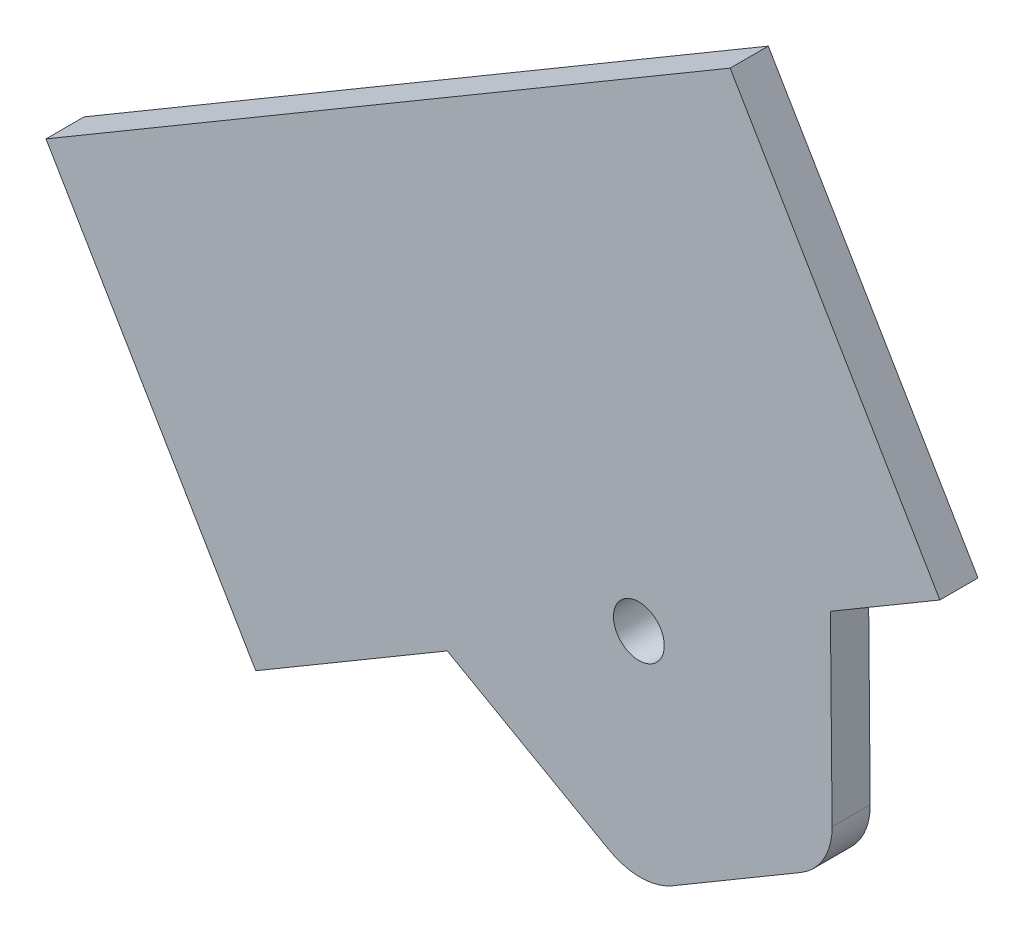
ISO-10303-21;
HEADER;
FILE_DESCRIPTION(('STEP AP214'),'2;1');
FILE_NAME('part.step','',(''),(''),'','','');
FILE_SCHEMA(('AUTOMOTIVE_DESIGN { 1 0 10303 214 1 1 1 1 }'));
ENDSEC;
DATA;
#1=APPLICATION_CONTEXT('core data for automotive mechanical design processes');
#2=APPLICATION_PROTOCOL_DEFINITION('international standard','automotive_design',2000,#1);
#3=PRODUCT_CONTEXT('',#1,'mechanical');
#4=PRODUCT('Part','Part','',(#3));
#5=PRODUCT_RELATED_PRODUCT_CATEGORY('part','',(#4));
#6=PRODUCT_DEFINITION_FORMATION('','',#4);
#7=PRODUCT_DEFINITION_CONTEXT('part definition',#1,'design');
#8=PRODUCT_DEFINITION('design','',#6,#7);
#9=PRODUCT_DEFINITION_SHAPE('','',#8);
#10=(LENGTH_UNIT() NAMED_UNIT(*) SI_UNIT(.MILLI.,.METRE.));
#11=(NAMED_UNIT(*) PLANE_ANGLE_UNIT() SI_UNIT($,.RADIAN.));
#12=(NAMED_UNIT(*) SI_UNIT($,.STERADIAN.) SOLID_ANGLE_UNIT());
#13=UNCERTAINTY_MEASURE_WITH_UNIT(LENGTH_MEASURE(1.E-05),#10,'distance_accuracy_value','');
#14=(GEOMETRIC_REPRESENTATION_CONTEXT(3) GLOBAL_UNCERTAINTY_ASSIGNED_CONTEXT((#13)) GLOBAL_UNIT_ASSIGNED_CONTEXT((#10,
#11,#12)) REPRESENTATION_CONTEXT('',''));
#15=CARTESIAN_POINT('',(0.,0.,0.));
#16=DIRECTION('',(0.,0.,1.));
#17=DIRECTION('',(1.,0.,0.));
#18=AXIS2_PLACEMENT_3D('',#15,#16,#17);
#19=CARTESIAN_POINT('',(48.5215928809247,334.718954291847,6.));
#20=DIRECTION('',(0.,0.,1.));
#21=DIRECTION('',(1.,0.,0.));
#22=AXIS2_PLACEMENT_3D('',#19,#20,#21);
#23=PLANE('',#22);
#24=DIRECTION('',(-0.861436542464855,-0.507865221595451,0.));
#25=VECTOR('',#24,1.);
#26=CARTESIAN_POINT('',(62.6758023990471,442.096939002382,6.));
#27=LINE('',#26,#25);
#28=CARTESIAN_POINT('',(62.6758023990471,442.096939002382,6.));
#29=VERTEX_POINT('',#28);
#30=CARTESIAN_POINT('',(-45.0037654090598,378.61378630295,6.));
#31=VERTEX_POINT('',#30);
#32=EDGE_CURVE('E169',#29,#31,#27,.T.);
#33=ORIENTED_EDGE('',*,*,#32,.T.);
#34=DIRECTION('',(0.507865221595452,-0.861436542464854,0.));
#35=VECTOR('',#34,1.);
#36=CARTESIAN_POINT('',(-45.0037654090598,378.61378630295,6.));
#37=LINE('',#36,#35);
#38=CARTESIAN_POINT('',(-11.9925260053554,322.620411042735,6.));
#39=VERTEX_POINT('',#38);
#40=EDGE_CURVE('E107',#31,#39,#37,.T.);
#41=ORIENTED_EDGE('',*,*,#40,.T.);
#42=DIRECTION('',(0.861436542464855,0.507865221595451,0.));
#43=VECTOR('',#42,1.);
#44=CARTESIAN_POINT('',(-11.9925260053554,322.620411042735,6.));
#45=LINE('',#44,#43);
#46=CARTESIAN_POINT('',(18.1577529809144,340.395693798575,6.));
#47=VERTEX_POINT('',#46);
#48=EDGE_CURVE('E190',#39,#47,#45,.T.);
#49=ORIENTED_EDGE('',*,*,#48,.T.);
#50=DIRECTION('',(0.87054245483269,-0.492093318725091,0.));
#51=VECTOR('',#50,1.);
#52=CARTESIAN_POINT('',(18.1577529809144,340.395693798575,6.));
#53=LINE('',#52,#51);
#54=CARTESIAN_POINT('',(43.6006596936724,326.013529743521,6.));
#55=VERTEX_POINT('',#54);
#56=EDGE_CURVE('E209',#47,#55,#53,.T.);
#57=ORIENTED_EDGE('',*,*,#56,.T.);
#58=CARTESIAN_POINT('',(48.5215928809247,334.718954291847,6.));
#59=DIRECTION('',(0.,0.,1.));
#60=DIRECTION('',(1.,0.,0.));
#61=AXIS2_PLACEMENT_3D('',#58,#59,#60);
#62=CIRCLE('',#61,9.99999999999956);
#63=CARTESIAN_POINT('',(53.6002450968778,326.104588867199,6.));
#64=VERTEX_POINT('',#63);
#65=EDGE_CURVE('E206',#55,#64,#62,.T.);
#66=ORIENTED_EDGE('',*,*,#65,.T.);
#67=DIRECTION('',(0.861436542464851,0.507865221595457,0.));
#68=VECTOR('',#67,1.);
#69=CARTESIAN_POINT('',(53.6002450968778,326.104588867199,6.));
#70=LINE('',#69,#68);
#71=CARTESIAN_POINT('',(73.8035116895097,338.015549175036,6.));
#72=VERTEX_POINT('',#71);
#73=EDGE_CURVE('E208',#64,#72,#70,.T.);
#74=ORIENTED_EDGE('',*,*,#73,.T.);
#75=CARTESIAN_POINT('',(68.7248594735504,346.62991459968,6.));
#76=DIRECTION('',(0.,0.,1.));
#77=DIRECTION('',(1.,0.,0.));
#78=AXIS2_PLACEMENT_3D('',#75,#76,#77);
#79=CIRCLE('',#78,9.99999999999771);
#80=CARTESIAN_POINT('',(78.7244448767529,346.720973723364,6.));
#81=VERTEX_POINT('',#80);
#82=EDGE_CURVE('E132',#72,#81,#79,.T.);
#83=ORIENTED_EDGE('',*,*,#82,.T.);
#84=DIRECTION('',(-0.00910591236757118,0.999958540320524,0.));
#85=VECTOR('',#84,1.);
#86=CARTESIAN_POINT('',(78.7244448767529,346.720973723364,6.));
#87=LINE('',#86,#85);
#88=CARTESIAN_POINT('',(78.4583109534542,375.946259310257,6.));
#89=VERTEX_POINT('',#88);
#90=EDGE_CURVE('E126',#81,#89,#87,.T.);
#91=ORIENTED_EDGE('',*,*,#90,.T.);
#92=DIRECTION('',(0.861436542464854,0.507865221595451,0.));
#93=VECTOR('',#92,1.);
#94=CARTESIAN_POINT('',(95.6870418027513,386.103563742166,6.));
#95=LINE('',#94,#93);
#96=CARTESIAN_POINT('',(95.6870418027513,386.103563742166,6.));
#97=VERTEX_POINT('',#96);
#98=EDGE_CURVE('E130',#89,#97,#95,.T.);
#99=ORIENTED_EDGE('',*,*,#98,.T.);
#100=DIRECTION('',(-0.50786522159545,0.861436542464855,0.));
#101=VECTOR('',#100,1.);
#102=CARTESIAN_POINT('',(62.6758023990471,442.096939002382,6.));
#103=LINE('',#102,#101);
#104=EDGE_CURVE('E58',#97,#29,#103,.T.);
#105=ORIENTED_EDGE('',*,*,#104,.T.);
#106=EDGE_LOOP('',(#33,#41,#49,#57,#66,#74,#83,#91,#99,#105));
#107=FACE_BOUND('',#106,.T.);
#108=CARTESIAN_POINT('',(48.3080319671843,358.170976554416,6.));
#109=DIRECTION('',(0.,0.,1.));
#110=DIRECTION('',(1.,0.,0.));
#111=AXIS2_PLACEMENT_3D('',#108,#109,#110);
#112=CIRCLE('',#111,4.00000000000441);
#113=CARTESIAN_POINT('',(52.3080319671887,358.170976554416,6.));
#114=VERTEX_POINT('',#113);
#115=EDGE_CURVE('E154',#114,#114,#112,.T.);
#116=ORIENTED_EDGE('',*,*,#115,.F.);
#117=EDGE_LOOP('',(#116));
#118=FACE_BOUND('',#117,.T.);
#119=ADVANCED_FACE('F41',(#107,#118),#23,.T.);
#120=CARTESIAN_POINT('',(48.5215928809247,334.718954291847,0.));
#121=DIRECTION('',(0.,0.,1.));
#122=DIRECTION('',(1.,0.,0.));
#123=AXIS2_PLACEMENT_3D('',#120,#121,#122);
#124=PLANE('',#123);
#125=DIRECTION('',(-0.861436542464855,-0.507865221595451,0.));
#126=VECTOR('',#125,1.);
#127=CARTESIAN_POINT('',(62.6758023990471,442.096939002382,0.));
#128=LINE('',#127,#126);
#129=CARTESIAN_POINT('',(62.6758023990471,442.096939002382,0.));
#130=VERTEX_POINT('',#129);
#131=CARTESIAN_POINT('',(-45.0037654090598,378.61378630295,0.));
#132=VERTEX_POINT('',#131);
#133=EDGE_CURVE('E150',#130,#132,#128,.T.);
#134=ORIENTED_EDGE('',*,*,#133,.F.);
#135=DIRECTION('',(-0.50786522159545,0.861436542464855,0.));
#136=VECTOR('',#135,1.);
#137=CARTESIAN_POINT('',(62.6758023990471,442.096939002382,0.));
#138=LINE('',#137,#136);
#139=CARTESIAN_POINT('',(95.6870418027513,386.103563742166,0.));
#140=VERTEX_POINT('',#139);
#141=EDGE_CURVE('E99',#140,#130,#138,.T.);
#142=ORIENTED_EDGE('',*,*,#141,.F.);
#143=DIRECTION('',(0.861436542464854,0.507865221595451,0.));
#144=VECTOR('',#143,1.);
#145=CARTESIAN_POINT('',(95.6870418027513,386.103563742166,0.));
#146=LINE('',#145,#144);
#147=CARTESIAN_POINT('',(78.4583109534542,375.946259310257,0.));
#148=VERTEX_POINT('',#147);
#149=EDGE_CURVE('E93',#148,#140,#146,.T.);
#150=ORIENTED_EDGE('',*,*,#149,.F.);
#151=DIRECTION('',(-0.00910591236757118,0.999958540320524,0.));
#152=VECTOR('',#151,1.);
#153=CARTESIAN_POINT('',(78.7244448767529,346.720973723364,0.));
#154=LINE('',#153,#152);
#155=CARTESIAN_POINT('',(78.7244448767529,346.720973723364,0.));
#156=VERTEX_POINT('',#155);
#157=EDGE_CURVE('E140',#156,#148,#154,.T.);
#158=ORIENTED_EDGE('',*,*,#157,.F.);
#159=CARTESIAN_POINT('',(68.7248594735504,346.62991459968,0.));
#160=DIRECTION('',(0.,0.,1.));
#161=DIRECTION('',(1.,0.,0.));
#162=AXIS2_PLACEMENT_3D('',#159,#160,#161);
#163=CIRCLE('',#162,9.99999999999771);
#164=CARTESIAN_POINT('',(73.8035116895097,338.015549175036,0.));
#165=VERTEX_POINT('',#164);
#166=EDGE_CURVE('E164',#165,#156,#163,.T.);
#167=ORIENTED_EDGE('',*,*,#166,.F.);
#168=DIRECTION('',(0.861436542464851,0.507865221595457,0.));
#169=VECTOR('',#168,1.);
#170=CARTESIAN_POINT('',(53.6002450968778,326.104588867199,0.));
#171=LINE('',#170,#169);
#172=CARTESIAN_POINT('',(53.6002450968778,326.104588867199,0.));
#173=VERTEX_POINT('',#172);
#174=EDGE_CURVE('E162',#173,#165,#171,.T.);
#175=ORIENTED_EDGE('',*,*,#174,.F.);
#176=CARTESIAN_POINT('',(48.5215928809247,334.718954291847,0.));
#177=DIRECTION('',(0.,0.,1.));
#178=DIRECTION('',(1.,0.,0.));
#179=AXIS2_PLACEMENT_3D('',#176,#177,#178);
#180=CIRCLE('',#179,9.99999999999956);
#181=CARTESIAN_POINT('',(43.6006596936724,326.013529743521,0.));
#182=VERTEX_POINT('',#181);
#183=EDGE_CURVE('E160',#182,#173,#180,.T.);
#184=ORIENTED_EDGE('',*,*,#183,.F.);
#185=DIRECTION('',(0.87054245483269,-0.492093318725091,0.));
#186=VECTOR('',#185,1.);
#187=CARTESIAN_POINT('',(18.1577529809144,340.395693798575,0.));
#188=LINE('',#187,#186);
#189=CARTESIAN_POINT('',(18.1577529809144,340.395693798575,0.));
#190=VERTEX_POINT('',#189);
#191=EDGE_CURVE('E158',#190,#182,#188,.T.);
#192=ORIENTED_EDGE('',*,*,#191,.F.);
#193=DIRECTION('',(0.861436542464855,0.507865221595451,0.));
#194=VECTOR('',#193,1.);
#195=CARTESIAN_POINT('',(-11.9925260053554,322.620411042735,0.));
#196=LINE('',#195,#194);
#197=CARTESIAN_POINT('',(-11.9925260053554,322.620411042735,0.));
#198=VERTEX_POINT('',#197);
#199=EDGE_CURVE('E156',#198,#190,#196,.T.);
#200=ORIENTED_EDGE('',*,*,#199,.F.);
#201=DIRECTION('',(0.507865221595452,-0.861436542464854,0.));
#202=VECTOR('',#201,1.);
#203=CARTESIAN_POINT('',(-45.0037654090598,378.61378630295,0.));
#204=LINE('',#203,#202);
#205=EDGE_CURVE('E153',#132,#198,#204,.T.);
#206=ORIENTED_EDGE('',*,*,#205,.F.);
#207=EDGE_LOOP('',(#134,#142,#150,#158,#167,#175,#184,#192,#200,#206));
#208=FACE_BOUND('',#207,.T.);
#209=CARTESIAN_POINT('',(48.3080319671843,358.170976554416,0.));
#210=DIRECTION('',(0.,0.,1.));
#211=DIRECTION('',(1.,0.,0.));
#212=AXIS2_PLACEMENT_3D('',#209,#210,#211);
#213=CIRCLE('',#212,4.00000000000441);
#214=CARTESIAN_POINT('',(52.3080319671887,358.170976554416,0.));
#215=VERTEX_POINT('',#214);
#216=EDGE_CURVE('E217',#215,#215,#213,.T.);
#217=ORIENTED_EDGE('',*,*,#216,.T.);
#218=EDGE_LOOP('',(#217));
#219=FACE_BOUND('',#218,.T.);
#220=ADVANCED_FACE('F194',(#208,#219),#124,.F.);
#221=CARTESIAN_POINT('',(62.6758023990471,442.096939002382,6.));
#222=DIRECTION('',(0.507865221595451,-0.861436542464855,0.));
#223=DIRECTION('',(0.861436542464855,0.507865221595451,0.));
#224=AXIS2_PLACEMENT_3D('',#221,#222,#223);
#225=PLANE('',#224);
#226=ORIENTED_EDGE('',*,*,#133,.T.);
#227=DIRECTION('',(0.,0.,-1.));
#228=VECTOR('',#227,1.);
#229=CARTESIAN_POINT('',(-45.0037654090598,378.61378630295,6.));
#230=LINE('',#229,#228);
#231=EDGE_CURVE('E11',#31,#132,#230,.T.);
#232=ORIENTED_EDGE('',*,*,#231,.F.);
#233=ORIENTED_EDGE('',*,*,#32,.F.);
#234=DIRECTION('',(0.,0.,-1.));
#235=VECTOR('',#234,1.);
#236=CARTESIAN_POINT('',(62.6758023990471,442.096939002382,6.));
#237=LINE('',#236,#235);
#238=EDGE_CURVE('E146',#29,#130,#237,.T.);
#239=ORIENTED_EDGE('',*,*,#238,.T.);
#240=EDGE_LOOP('',(#226,#232,#233,#239));
#241=FACE_BOUND('',#240,.T.);
#242=ADVANCED_FACE('F43',(#241),#225,.F.);
#243=CARTESIAN_POINT('',(-45.0037654090598,378.61378630295,6.));
#244=DIRECTION('',(0.861436542464854,0.507865221595452,0.));
#245=DIRECTION('',(-0.507865221595452,0.861436542464854,0.));
#246=AXIS2_PLACEMENT_3D('',#243,#244,#245);
#247=PLANE('',#246);
#248=ORIENTED_EDGE('',*,*,#205,.T.);
#249=DIRECTION('',(0.,0.,-1.));
#250=VECTOR('',#249,1.);
#251=CARTESIAN_POINT('',(-11.9925260053554,322.620411042735,6.));
#252=LINE('',#251,#250);
#253=EDGE_CURVE('E50',#39,#198,#252,.T.);
#254=ORIENTED_EDGE('',*,*,#253,.F.);
#255=ORIENTED_EDGE('',*,*,#40,.F.);
#256=ORIENTED_EDGE('',*,*,#231,.T.);
#257=EDGE_LOOP('',(#248,#254,#255,#256));
#258=FACE_BOUND('',#257,.T.);
#259=ADVANCED_FACE('F253',(#258),#247,.F.);
#260=CARTESIAN_POINT('',(-11.9925260053554,322.620411042735,6.));
#261=DIRECTION('',(-0.507865221595451,0.861436542464855,0.));
#262=DIRECTION('',(-0.861436542464855,-0.507865221595451,0.));
#263=AXIS2_PLACEMENT_3D('',#260,#261,#262);
#264=PLANE('',#263);
#265=ORIENTED_EDGE('',*,*,#199,.T.);
#266=DIRECTION('',(0.,0.,-1.));
#267=VECTOR('',#266,1.);
#268=CARTESIAN_POINT('',(18.1577529809144,340.395693798575,6.));
#269=LINE('',#268,#267);
#270=EDGE_CURVE('E182',#47,#190,#269,.T.);
#271=ORIENTED_EDGE('',*,*,#270,.F.);
#272=ORIENTED_EDGE('',*,*,#48,.F.);
#273=ORIENTED_EDGE('',*,*,#253,.T.);
#274=EDGE_LOOP('',(#265,#271,#272,#273));
#275=FACE_BOUND('',#274,.T.);
#276=ADVANCED_FACE('F188',(#275),#264,.F.);
#277=CARTESIAN_POINT('',(18.1577529809144,340.395693798575,6.));
#278=DIRECTION('',(0.492093318725091,0.87054245483269,0.));
#279=DIRECTION('',(-0.87054245483269,0.492093318725091,0.));
#280=AXIS2_PLACEMENT_3D('',#277,#278,#279);
#281=PLANE('',#280);
#282=ORIENTED_EDGE('',*,*,#191,.T.);
#283=DIRECTION('',(0.,0.,-1.));
#284=VECTOR('',#283,1.);
#285=CARTESIAN_POINT('',(43.6006596936724,326.013529743521,6.));
#286=LINE('',#285,#284);
#287=EDGE_CURVE('E179',#55,#182,#286,.T.);
#288=ORIENTED_EDGE('',*,*,#287,.F.);
#289=ORIENTED_EDGE('',*,*,#56,.F.);
#290=ORIENTED_EDGE('',*,*,#270,.T.);
#291=EDGE_LOOP('',(#282,#288,#289,#290));
#292=FACE_BOUND('',#291,.T.);
#293=ADVANCED_FACE('F200',(#292),#281,.F.);
#294=CARTESIAN_POINT('',(48.5215928809247,334.718954291847,6.));
#295=DIRECTION('',(0.,0.,-1.));
#296=DIRECTION('',(-1.,0.,0.));
#297=AXIS2_PLACEMENT_3D('',#294,#295,#296);
#298=CYLINDRICAL_SURFACE('',#297,9.99999999999956);
#299=ORIENTED_EDGE('',*,*,#183,.T.);
#300=DIRECTION('',(0.,0.,-1.));
#301=VECTOR('',#300,1.);
#302=CARTESIAN_POINT('',(53.6002450968778,326.104588867199,6.));
#303=LINE('',#302,#301);
#304=EDGE_CURVE('E176',#64,#173,#303,.T.);
#305=ORIENTED_EDGE('',*,*,#304,.F.);
#306=ORIENTED_EDGE('',*,*,#65,.F.);
#307=ORIENTED_EDGE('',*,*,#287,.T.);
#308=EDGE_LOOP('',(#299,#305,#306,#307));
#309=FACE_BOUND('',#308,.T.);
#310=ADVANCED_FACE('F204',(#309),#298,.T.);
#311=CARTESIAN_POINT('',(53.6002450968778,326.104588867199,6.));
#312=DIRECTION('',(-0.507865221595457,0.861436542464851,0.));
#313=DIRECTION('',(-0.861436542464851,-0.507865221595457,0.));
#314=AXIS2_PLACEMENT_3D('',#311,#312,#313);
#315=PLANE('',#314);
#316=ORIENTED_EDGE('',*,*,#174,.T.);
#317=DIRECTION('',(0.,0.,-1.));
#318=VECTOR('',#317,1.);
#319=CARTESIAN_POINT('',(73.8035116895097,338.015549175036,6.));
#320=LINE('',#319,#318);
#321=EDGE_CURVE('E173',#72,#165,#320,.T.);
#322=ORIENTED_EDGE('',*,*,#321,.F.);
#323=ORIENTED_EDGE('',*,*,#73,.F.);
#324=ORIENTED_EDGE('',*,*,#304,.T.);
#325=EDGE_LOOP('',(#316,#322,#323,#324));
#326=FACE_BOUND('',#325,.T.);
#327=ADVANCED_FACE('F243',(#326),#315,.F.);
#328=CARTESIAN_POINT('',(68.7248594735504,346.62991459968,6.));
#329=DIRECTION('',(0.,0.,-1.));
#330=DIRECTION('',(-1.,0.,0.));
#331=AXIS2_PLACEMENT_3D('',#328,#329,#330);
#332=CYLINDRICAL_SURFACE('',#331,9.99999999999771);
#333=ORIENTED_EDGE('',*,*,#166,.T.);
#334=DIRECTION('',(0.,0.,-1.));
#335=VECTOR('',#334,1.);
#336=CARTESIAN_POINT('',(78.7244448767529,346.720973723364,6.));
#337=LINE('',#336,#335);
#338=EDGE_CURVE('E141',#81,#156,#337,.T.);
#339=ORIENTED_EDGE('',*,*,#338,.F.);
#340=ORIENTED_EDGE('',*,*,#82,.F.);
#341=ORIENTED_EDGE('',*,*,#321,.T.);
#342=EDGE_LOOP('',(#333,#339,#340,#341));
#343=FACE_BOUND('',#342,.T.);
#344=ADVANCED_FACE('F240',(#343),#332,.T.);
#345=CARTESIAN_POINT('',(78.7244448767529,346.720973723364,6.));
#346=DIRECTION('',(-0.999958540320525,-0.00910591236757118,0.));
#347=DIRECTION('',(0.00910591236757118,-0.999958540320525,0.));
#348=AXIS2_PLACEMENT_3D('',#345,#346,#347);
#349=PLANE('',#348);
#350=ORIENTED_EDGE('',*,*,#157,.T.);
#351=DIRECTION('',(0.,0.,-1.));
#352=VECTOR('',#351,1.);
#353=CARTESIAN_POINT('',(78.4583109534542,375.946259310257,6.));
#354=LINE('',#353,#352);
#355=EDGE_CURVE('E137',#89,#148,#354,.T.);
#356=ORIENTED_EDGE('',*,*,#355,.F.);
#357=ORIENTED_EDGE('',*,*,#90,.F.);
#358=ORIENTED_EDGE('',*,*,#338,.T.);
#359=EDGE_LOOP('',(#350,#356,#357,#358));
#360=FACE_BOUND('',#359,.T.);
#361=ADVANCED_FACE('F138',(#360),#349,.F.);
#362=CARTESIAN_POINT('',(95.6870418027513,386.103563742166,6.));
#363=DIRECTION('',(-0.507865221595451,0.861436542464855,0.));
#364=DIRECTION('',(-0.861436542464855,-0.507865221595451,0.));
#365=AXIS2_PLACEMENT_3D('',#362,#363,#364);
#366=PLANE('',#365);
#367=ORIENTED_EDGE('',*,*,#149,.T.);
#368=DIRECTION('',(0.,0.,-1.));
#369=VECTOR('',#368,1.);
#370=CARTESIAN_POINT('',(95.6870418027513,386.103563742166,6.));
#371=LINE('',#370,#369);
#372=EDGE_CURVE('E142',#97,#140,#371,.T.);
#373=ORIENTED_EDGE('',*,*,#372,.F.);
#374=ORIENTED_EDGE('',*,*,#98,.F.);
#375=ORIENTED_EDGE('',*,*,#355,.T.);
#376=EDGE_LOOP('',(#367,#373,#374,#375));
#377=FACE_BOUND('',#376,.T.);
#378=ADVANCED_FACE('F144',(#377),#366,.F.);
#379=CARTESIAN_POINT('',(62.6758023990471,442.096939002382,6.));
#380=DIRECTION('',(-0.861436542464855,-0.50786522159545,0.));
#381=DIRECTION('',(0.50786522159545,-0.861436542464855,0.));
#382=AXIS2_PLACEMENT_3D('',#379,#380,#381);
#383=PLANE('',#382);
#384=ORIENTED_EDGE('',*,*,#141,.T.);
#385=ORIENTED_EDGE('',*,*,#238,.F.);
#386=ORIENTED_EDGE('',*,*,#104,.F.);
#387=ORIENTED_EDGE('',*,*,#372,.T.);
#388=EDGE_LOOP('',(#384,#385,#386,#387));
#389=FACE_BOUND('',#388,.T.);
#390=ADVANCED_FACE('F233',(#389),#383,.F.);
#391=CARTESIAN_POINT('',(48.3080319671843,358.170976554416,6.));
#392=DIRECTION('',(0.,0.,-1.));
#393=DIRECTION('',(-1.,0.,0.));
#394=AXIS2_PLACEMENT_3D('',#391,#392,#393);
#395=CYLINDRICAL_SURFACE('',#394,4.00000000000441);
#396=ORIENTED_EDGE('',*,*,#115,.T.);
#397=EDGE_LOOP('',(#396));
#398=FACE_BOUND('',#397,.T.);
#399=ORIENTED_EDGE('',*,*,#216,.F.);
#400=EDGE_LOOP('',(#399));
#401=FACE_BOUND('',#400,.T.);
#402=ADVANCED_FACE('F223',(#398,#401),#395,.F.);
#403=CLOSED_SHELL('',(#119,#220,#242,#259,#276,#293,#310,#327,#344,#361,#378,#390,#402));
#404=MANIFOLD_SOLID_BREP('B2',#403);
#405=ADVANCED_BREP_SHAPE_REPRESENTATION('',(#18,#404),#14);
#406=SHAPE_DEFINITION_REPRESENTATION(#9,#405);
ENDSEC;
END-ISO-10303-21;
